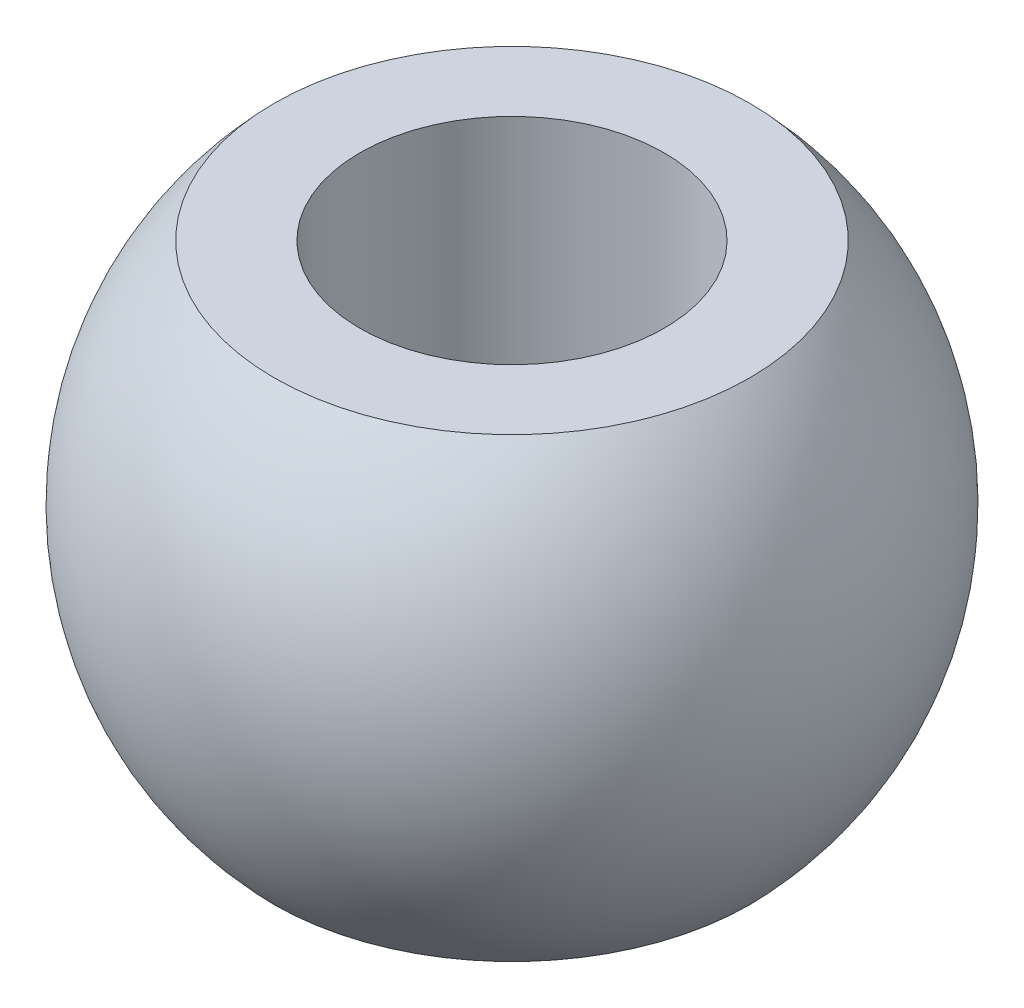
ISO-10303-21;
HEADER;
FILE_DESCRIPTION(('STEP AP214'),'2;1');
FILE_NAME('part.step','',(''),(''),'','','');
FILE_SCHEMA(('AUTOMOTIVE_DESIGN { 1 0 10303 214 1 1 1 1 }'));
ENDSEC;
DATA;
#1=APPLICATION_CONTEXT('core data for automotive mechanical design processes');
#2=APPLICATION_PROTOCOL_DEFINITION('international standard','automotive_design',2000,#1);
#3=PRODUCT_CONTEXT('',#1,'mechanical');
#4=PRODUCT('Part','Part','',(#3));
#5=PRODUCT_RELATED_PRODUCT_CATEGORY('part','',(#4));
#6=PRODUCT_DEFINITION_FORMATION('','',#4);
#7=PRODUCT_DEFINITION_CONTEXT('part definition',#1,'design');
#8=PRODUCT_DEFINITION('design','',#6,#7);
#9=PRODUCT_DEFINITION_SHAPE('','',#8);
#10=(LENGTH_UNIT() NAMED_UNIT(*) SI_UNIT(.MILLI.,.METRE.));
#11=(NAMED_UNIT(*) PLANE_ANGLE_UNIT() SI_UNIT($,.RADIAN.));
#12=(NAMED_UNIT(*) SI_UNIT($,.STERADIAN.) SOLID_ANGLE_UNIT());
#13=UNCERTAINTY_MEASURE_WITH_UNIT(LENGTH_MEASURE(1.E-05),#10,'distance_accuracy_value','');
#14=(GEOMETRIC_REPRESENTATION_CONTEXT(3) GLOBAL_UNCERTAINTY_ASSIGNED_CONTEXT((#13)) GLOBAL_UNIT_ASSIGNED_CONTEXT((#10,
#11,#12)) REPRESENTATION_CONTEXT('',''));
#15=CARTESIAN_POINT('',(0.,0.,0.));
#16=DIRECTION('',(0.,0.,1.));
#17=DIRECTION('',(1.,0.,0.));
#18=AXIS2_PLACEMENT_3D('',#15,#16,#17);
#19=CARTESIAN_POINT('',(0.,0.,0.));
#20=DIRECTION('',(0.,1.,0.));
#21=DIRECTION('',(1.,0.,0.));
#22=AXIS2_PLACEMENT_3D('',#19,#20,#21);
#23=SPHERICAL_SURFACE('',#22,6.5);
#24=CARTESIAN_POINT('',(0.,4.5,0.));
#25=DIRECTION('',(0.,1.,0.));
#26=DIRECTION('',(0.,0.,1.));
#27=AXIS2_PLACEMENT_3D('',#24,#25,#26);
#28=CIRCLE('',#27,4.69041575982343);
#29=CARTESIAN_POINT('',(4.69041575982343,4.5,0.));
#30=VERTEX_POINT('',#29);
#31=EDGE_CURVE('E10',#30,#30,#28,.T.);
#32=CARTESIAN_POINT('',(0.,-4.5,0.));
#33=DIRECTION('',(0.,1.,0.));
#34=DIRECTION('',(0.,0.,1.));
#35=AXIS2_PLACEMENT_3D('',#32,#33,#34);
#36=CIRCLE('',#35,4.69041575982343);
#37=CARTESIAN_POINT('',(4.69041575982343,-4.5,0.));
#38=VERTEX_POINT('',#37);
#39=EDGE_CURVE('E40',#38,#38,#36,.T.);
#40=CARTESIAN_POINT('',(4.69041575982343,4.5,0.));
#41=CARTESIAN_POINT('',(4.76210624204994,4.42527889124895,0.));
#42=CARTESIAN_POINT('',(4.83200814280828,4.34884204442719,0.));
#43=CARTESIAN_POINT('',(4.96808186456599,4.19271728905302,0.));
#44=CARTESIAN_POINT('',(5.03425368556536,4.11302938050061,0.));
#45=CARTESIAN_POINT('',(5.16271433098249,3.95058291607591,0.));
#46=CARTESIAN_POINT('',(5.22500315540024,3.86782436020362,0.));
#47=CARTESIAN_POINT('',(5.34555604093116,3.69942601736772,0.));
#48=CARTESIAN_POINT('',(5.40382010204432,3.61378623040411,0.));
#49=CARTESIAN_POINT('',(5.51619027400762,3.43982088843359,0.));
#50=CARTESIAN_POINT('',(5.57029638485776,3.35149533342669,0.));
#51=CARTESIAN_POINT('',(5.67422712872888,3.17236019474046,0.));
#52=CARTESIAN_POINT('',(5.72405176174988,3.08155061106114,0.));
#53=CARTESIAN_POINT('',(5.81930575610283,2.89765478890911,0.));
#54=CARTESIAN_POINT('',(5.86473511743478,2.80456855043642,0.));
#55=CARTESIAN_POINT('',(5.95109482380328,2.61633200203106,0.));
#56=CARTESIAN_POINT('',(5.99202516883983,2.5211816920984,0.));
#57=CARTESIAN_POINT('',(6.06929336926804,2.32903429508149,0.));
#58=CARTESIAN_POINT('',(6.10563122465969,2.23203720799725,0.));
#59=CARTESIAN_POINT('',(6.17363146116803,2.03641776920925,0.));
#60=CARTESIAN_POINT('',(6.20529384228472,1.9377954175055,0.));
#61=CARTESIAN_POINT('',(6.26387082277354,1.73915067343224,0.));
#62=CARTESIAN_POINT('',(6.29078542214567,1.63912828106274,0.));
#63=CARTESIAN_POINT('',(6.33980537425188,1.43791187693933,0.));
#64=CARTESIAN_POINT('',(6.36191072698596,1.33671786518543,0.));
#65=CARTESIAN_POINT('',(6.40126170378928,1.13338931918914,0.));
#66=CARTESIAN_POINT('',(6.41850732785851,1.03125478494676,0.));
#67=CARTESIAN_POINT('',(6.44809946347847,0.826278438745693,0.));
#68=CARTESIAN_POINT('',(6.4604459750292,0.723436626787011,0.));
#69=CARTESIAN_POINT('',(6.48021168986709,0.517280585135567,0.));
#70=CARTESIAN_POINT('',(6.48763089315426,0.413966355442804,0.));
#71=CARTESIAN_POINT('',(6.49752504822071,0.207101417166694,0.));
#72=CARTESIAN_POINT('',(6.5,0.103550708583347,0.));
#73=CARTESIAN_POINT('',(6.5,-0.103550708583348,0.));
#74=CARTESIAN_POINT('',(6.49752504822071,-0.207101417166695,0.));
#75=CARTESIAN_POINT('',(6.48763089315426,-0.413966355442805,0.));
#76=CARTESIAN_POINT('',(6.48021168986709,-0.517280585135568,0.));
#77=CARTESIAN_POINT('',(6.4604459750292,-0.723436626787012,0.));
#78=CARTESIAN_POINT('',(6.44809946347847,-0.826278438745694,0.));
#79=CARTESIAN_POINT('',(6.41850732785851,-1.03125478494676,0.));
#80=CARTESIAN_POINT('',(6.40126170378928,-1.13338931918914,0.));
#81=CARTESIAN_POINT('',(6.36191072698596,-1.33671786518543,0.));
#82=CARTESIAN_POINT('',(6.33980537425188,-1.43791187693933,0.));
#83=CARTESIAN_POINT('',(6.29078542214567,-1.63912828106274,0.));
#84=CARTESIAN_POINT('',(6.26387082277354,-1.73915067343224,0.));
#85=CARTESIAN_POINT('',(6.20529384228472,-1.9377954175055,0.));
#86=CARTESIAN_POINT('',(6.17363146116803,-2.03641776920925,0.));
#87=CARTESIAN_POINT('',(6.10563122465969,-2.23203720799725,0.));
#88=CARTESIAN_POINT('',(6.06929336926804,-2.32903429508149,0.));
#89=CARTESIAN_POINT('',(5.99202516883983,-2.5211816920984,0.));
#90=CARTESIAN_POINT('',(5.95109482380328,-2.61633200203106,0.));
#91=CARTESIAN_POINT('',(5.86473511743478,-2.80456855043642,0.));
#92=CARTESIAN_POINT('',(5.81930575610282,-2.89765478890912,0.));
#93=CARTESIAN_POINT('',(5.72405176174988,-3.08155061106114,0.));
#94=CARTESIAN_POINT('',(5.67422712872889,-3.17236019474046,0.));
#95=CARTESIAN_POINT('',(5.57029638485776,-3.35149533342669,0.));
#96=CARTESIAN_POINT('',(5.51619027400762,-3.43982088843359,0.));
#97=CARTESIAN_POINT('',(5.40382010204432,-3.61378623040411,0.));
#98=CARTESIAN_POINT('',(5.34555604093116,-3.69942601736772,0.));
#99=CARTESIAN_POINT('',(5.22500315540024,-3.86782436020362,0.));
#100=CARTESIAN_POINT('',(5.16271433098249,-3.95058291607591,0.));
#101=CARTESIAN_POINT('',(5.03425368556536,-4.11302938050062,0.));
#102=CARTESIAN_POINT('',(4.96808186456599,-4.19271728905302,0.));
#103=CARTESIAN_POINT('',(4.83200814280828,-4.34884204442719,0.));
#104=CARTESIAN_POINT('',(4.76210624204994,-4.42527889124895,0.));
#105=CARTESIAN_POINT('',(4.69041575982343,-4.5,0.));
#106=B_SPLINE_CURVE_WITH_KNOTS('',3,(#40,#41,#42,#43,#44,#45,#46,#47,#48,#49,#50,#51,#52,#53,
#54,#55,#56,#57,#58,#59,#60,#61,#62,#63,#64,#65,#66,#67,#68,#69,#70,#71,#72,#73,#74,#75,#76,#77,
#78,#79,#80,#81,#82,#83,#84,#85,#86,#87,#88,#89,#90,#91,#92,#93,#94,#95,#96,#97,#98,#99,#100,
#101,#102,#103,#104,#105),.UNSPECIFIED.,.F.,.F.,(4,2,2,2,2,2,2,2,2,2,2,2,2,2,2,2,2,2,2,2,2,2,2,
2,2,2,2,2,2,2,2,2,4),(0.,0.310622570111457,0.621245140222913,0.93186771033437,1.24249028044583,
1.55311285055728,1.86373542066874,2.1743579907802,2.48498056089165,2.79560313100311,
3.10622570111457,3.41684827122602,3.72747084133748,4.03809341144894,4.3487159815604,
4.65933855167185,4.96996112178331,5.28058369189477,5.59120626200622,5.90182883211768,
6.21245140222914,6.52307397234059,6.83369654245205,7.14431911256351,7.45494168267496,
7.76556425278642,8.07618682289788,8.38680939300933,8.69743196312079,9.00805453323225,
9.3186771033437,9.62929967345516,9.93992224356662),.UNSPECIFIED.);
#107=EDGE_CURVE('BSEAM34',#30,#38,#106,.T.);
#108=ORIENTED_EDGE('',*,*,#31,.F.);
#109=ORIENTED_EDGE('',*,*,#39,.T.);
#110=ORIENTED_EDGE('',*,*,#107,.T.);
#111=ORIENTED_EDGE('',*,*,#107,.F.);
#112=EDGE_LOOP('',(#108,#110,#109,#111));
#113=FACE_BOUND('',#112,.T.);
#114=ADVANCED_FACE('F34',(#113),#23,.T.);
#115=CARTESIAN_POINT('',(0.,4.5,0.));
#116=DIRECTION('',(0.,-1.,0.));
#117=DIRECTION('',(0.,0.,-1.));
#118=AXIS2_PLACEMENT_3D('',#115,#116,#117);
#119=PLANE('',#118);
#120=CARTESIAN_POINT('',(0.,4.5,0.));
#121=DIRECTION('',(0.,1.,0.));
#122=DIRECTION('',(-1.,0.,0.));
#123=AXIS2_PLACEMENT_3D('',#120,#121,#122);
#124=CIRCLE('',#123,3.);
#125=CARTESIAN_POINT('',(-3.,4.5,0.));
#126=VERTEX_POINT('',#125);
#127=EDGE_CURVE('E48',#126,#126,#124,.T.);
#128=ORIENTED_EDGE('',*,*,#127,.F.);
#129=EDGE_LOOP('',(#128));
#130=FACE_BOUND('',#129,.T.);
#131=ORIENTED_EDGE('',*,*,#31,.T.);
#132=EDGE_LOOP('',(#131));
#133=FACE_BOUND('',#132,.T.);
#134=ADVANCED_FACE('F56',(#130,#133),#119,.F.);
#135=CARTESIAN_POINT('',(0.,-4.5,0.));
#136=DIRECTION('',(0.,1.,0.));
#137=DIRECTION('',(0.,0.,1.));
#138=AXIS2_PLACEMENT_3D('',#135,#136,#137);
#139=PLANE('',#138);
#140=CARTESIAN_POINT('',(0.,-4.5,0.));
#141=DIRECTION('',(0.,1.,0.));
#142=DIRECTION('',(-1.,0.,0.));
#143=AXIS2_PLACEMENT_3D('',#140,#141,#142);
#144=CIRCLE('',#143,3.);
#145=CARTESIAN_POINT('',(-3.,-4.5,0.));
#146=VERTEX_POINT('',#145);
#147=EDGE_CURVE('E44',#146,#146,#144,.T.);
#148=ORIENTED_EDGE('',*,*,#147,.T.);
#149=EDGE_LOOP('',(#148));
#150=FACE_BOUND('',#149,.T.);
#151=ORIENTED_EDGE('',*,*,#39,.F.);
#152=EDGE_LOOP('',(#151));
#153=FACE_BOUND('',#152,.T.);
#154=ADVANCED_FACE('F58',(#150,#153),#139,.F.);
#155=CARTESIAN_POINT('',(0.,-4.5,0.));
#156=DIRECTION('',(0.,1.,0.));
#157=DIRECTION('',(-1.,0.,0.));
#158=AXIS2_PLACEMENT_3D('',#155,#156,#157);
#159=CYLINDRICAL_SURFACE('',#158,3.);
#160=ORIENTED_EDGE('',*,*,#147,.F.);
#161=EDGE_LOOP('',(#160));
#162=FACE_BOUND('',#161,.T.);
#163=ORIENTED_EDGE('',*,*,#127,.T.);
#164=EDGE_LOOP('',(#163));
#165=FACE_BOUND('',#164,.T.);
#166=ADVANCED_FACE('F54',(#162,#165),#159,.F.);
#167=CLOSED_SHELL('',(#114,#134,#154,#166));
#168=MANIFOLD_SOLID_BREP('B2',#167);
#169=ADVANCED_BREP_SHAPE_REPRESENTATION('',(#18,#168),#14);
#170=SHAPE_DEFINITION_REPRESENTATION(#9,#169);
ENDSEC;
END-ISO-10303-21;
